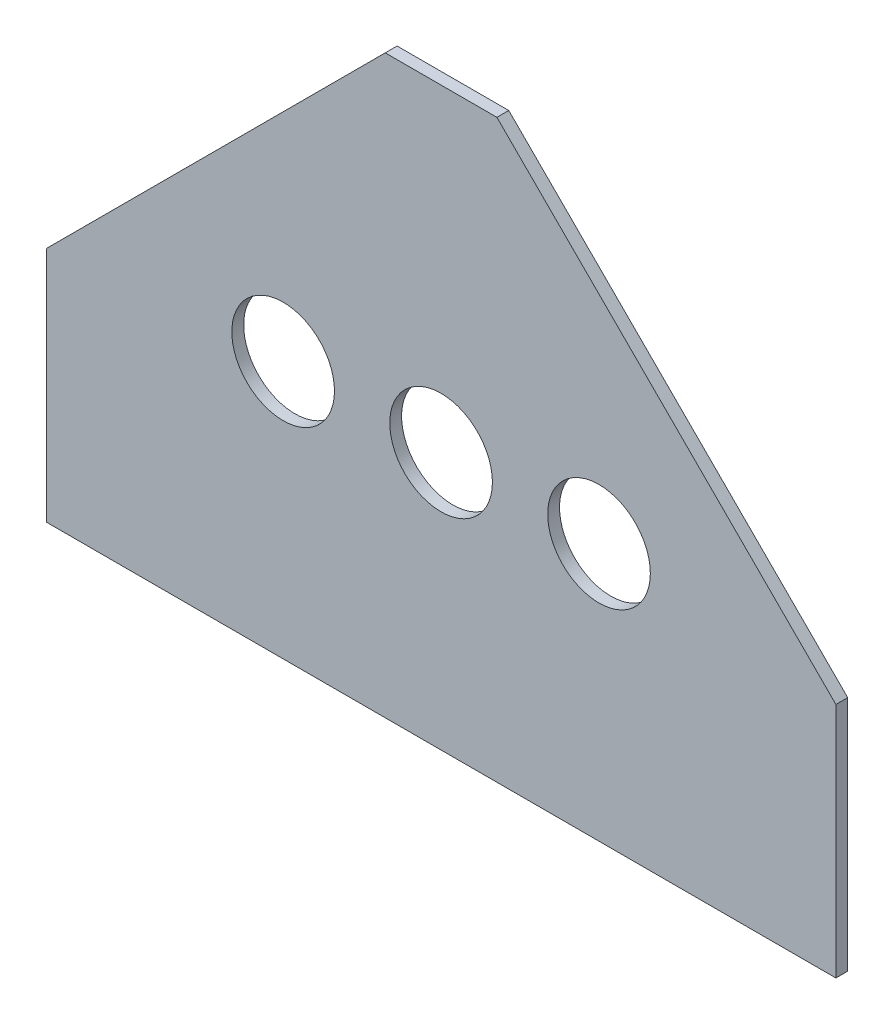
ISO-10303-21;
HEADER;
FILE_DESCRIPTION(('STEP AP214'),'2;1');
FILE_NAME('part.step','',(''),(''),'','','');
FILE_SCHEMA(('AUTOMOTIVE_DESIGN { 1 0 10303 214 1 1 1 1 }'));
ENDSEC;
DATA;
#1=APPLICATION_CONTEXT('core data for automotive mechanical design processes');
#2=APPLICATION_PROTOCOL_DEFINITION('international standard','automotive_design',2000,#1);
#3=PRODUCT_CONTEXT('',#1,'mechanical');
#4=PRODUCT('Part','Part','',(#3));
#5=PRODUCT_RELATED_PRODUCT_CATEGORY('part','',(#4));
#6=PRODUCT_DEFINITION_FORMATION('','',#4);
#7=PRODUCT_DEFINITION_CONTEXT('part definition',#1,'design');
#8=PRODUCT_DEFINITION('design','',#6,#7);
#9=PRODUCT_DEFINITION_SHAPE('','',#8);
#10=(LENGTH_UNIT() NAMED_UNIT(*) SI_UNIT(.MILLI.,.METRE.));
#11=(NAMED_UNIT(*) PLANE_ANGLE_UNIT() SI_UNIT($,.RADIAN.));
#12=(NAMED_UNIT(*) SI_UNIT($,.STERADIAN.) SOLID_ANGLE_UNIT());
#13=UNCERTAINTY_MEASURE_WITH_UNIT(LENGTH_MEASURE(1.E-05),#10,'distance_accuracy_value','');
#14=(GEOMETRIC_REPRESENTATION_CONTEXT(3) GLOBAL_UNCERTAINTY_ASSIGNED_CONTEXT((#13)) GLOBAL_UNIT_ASSIGNED_CONTEXT((#10,
#11,#12)) REPRESENTATION_CONTEXT('',''));
#15=CARTESIAN_POINT('',(0.,0.,0.));
#16=DIRECTION('',(0.,0.,1.));
#17=DIRECTION('',(1.,0.,0.));
#18=AXIS2_PLACEMENT_3D('',#15,#16,#17);
#19=CARTESIAN_POINT('',(-50.,0.,-1.5));
#20=DIRECTION('',(-1.,0.,0.));
#21=DIRECTION('',(0.,0.,1.));
#22=AXIS2_PLACEMENT_3D('',#19,#20,#21);
#23=PLANE('',#22);
#24=DIRECTION('',(0.,-1.,0.));
#25=VECTOR('',#24,1.);
#26=CARTESIAN_POINT('',(-50.,0.,0.));
#27=LINE('',#26,#25);
#28=CARTESIAN_POINT('',(-50.,30.,0.));
#29=VERTEX_POINT('',#28);
#30=CARTESIAN_POINT('',(-50.,0.,0.));
#31=VERTEX_POINT('',#30);
#32=EDGE_CURVE('E129',#29,#31,#27,.T.);
#33=ORIENTED_EDGE('',*,*,#32,.F.);
#34=DIRECTION('',(0.,0.,1.));
#35=VECTOR('',#34,1.);
#36=CARTESIAN_POINT('',(-50.,30.,-1.5));
#37=LINE('',#36,#35);
#38=CARTESIAN_POINT('',(-50.,30.,-1.5));
#39=VERTEX_POINT('',#38);
#40=EDGE_CURVE('E115',#39,#29,#37,.T.);
#41=ORIENTED_EDGE('',*,*,#40,.F.);
#42=DIRECTION('',(0.,-1.,0.));
#43=VECTOR('',#42,1.);
#44=CARTESIAN_POINT('',(-50.,0.,-1.5));
#45=LINE('',#44,#43);
#46=CARTESIAN_POINT('',(-50.,0.,-1.5));
#47=VERTEX_POINT('',#46);
#48=EDGE_CURVE('E108',#39,#47,#45,.T.);
#49=ORIENTED_EDGE('',*,*,#48,.T.);
#50=DIRECTION('',(0.,0.,1.));
#51=VECTOR('',#50,1.);
#52=CARTESIAN_POINT('',(-50.,0.,-1.5));
#53=LINE('',#52,#51);
#54=EDGE_CURVE('E91',#47,#31,#53,.T.);
#55=ORIENTED_EDGE('',*,*,#54,.T.);
#56=EDGE_LOOP('',(#33,#41,#49,#55));
#57=FACE_BOUND('',#56,.T.);
#58=ADVANCED_FACE('F40',(#57),#23,.T.);
#59=CARTESIAN_POINT('',(-50.,30.,-1.5));
#60=DIRECTION('',(-0.707106781186549,0.707106781186546,0.));
#61=DIRECTION('',(-0.707106781186546,-0.707106781186549,0.));
#62=AXIS2_PLACEMENT_3D('',#59,#60,#61);
#63=PLANE('',#62);
#64=DIRECTION('',(-0.707106781186546,-0.707106781186549,0.));
#65=VECTOR('',#64,1.);
#66=CARTESIAN_POINT('',(-50.,30.,0.));
#67=LINE('',#66,#65);
#68=CARTESIAN_POINT('',(-7.07106781186548,72.9289321881347,0.));
#69=VERTEX_POINT('',#68);
#70=EDGE_CURVE('E116',#69,#29,#67,.T.);
#71=ORIENTED_EDGE('',*,*,#70,.F.);
#72=DIRECTION('',(0.,0.,-1.));
#73=VECTOR('',#72,1.);
#74=CARTESIAN_POINT('',(-7.07106781186548,72.9289321881347,-1.5));
#75=LINE('',#74,#73);
#76=CARTESIAN_POINT('',(-7.07106781186547,72.9289321881347,-1.5));
#77=VERTEX_POINT('',#76);
#78=EDGE_CURVE('E48',#69,#77,#75,.T.);
#79=ORIENTED_EDGE('',*,*,#78,.T.);
#80=DIRECTION('',(-0.707106781186546,-0.707106781186549,0.));
#81=VECTOR('',#80,1.);
#82=CARTESIAN_POINT('',(-50.,30.,-1.5));
#83=LINE('',#82,#81);
#84=EDGE_CURVE('E102',#77,#39,#83,.T.);
#85=ORIENTED_EDGE('',*,*,#84,.T.);
#86=ORIENTED_EDGE('',*,*,#40,.T.);
#87=EDGE_LOOP('',(#71,#79,#85,#86));
#88=FACE_BOUND('',#87,.T.);
#89=ADVANCED_FACE('F163',(#88),#63,.T.);
#90=CARTESIAN_POINT('',(0.,80.0000000000002,-1.5));
#91=DIRECTION('',(0.707106781186549,0.707106781186546,0.));
#92=DIRECTION('',(-0.707106781186546,0.707106781186549,0.));
#93=AXIS2_PLACEMENT_3D('',#90,#91,#92);
#94=PLANE('',#93);
#95=DIRECTION('',(-0.707106781186546,0.707106781186549,0.));
#96=VECTOR('',#95,1.);
#97=CARTESIAN_POINT('',(0.,80.0000000000002,-1.5));
#98=LINE('',#97,#96);
#99=CARTESIAN_POINT('',(50.,30.,-1.5));
#100=VERTEX_POINT('',#99);
#101=CARTESIAN_POINT('',(7.0710678118654,72.9289321881348,-1.5));
#102=VERTEX_POINT('',#101);
#103=EDGE_CURVE('E125',#100,#102,#98,.T.);
#104=ORIENTED_EDGE('',*,*,#103,.T.);
#105=DIRECTION('',(0.,0.,1.));
#106=VECTOR('',#105,1.);
#107=CARTESIAN_POINT('',(7.07106781186541,72.9289321881348,-1.5));
#108=LINE('',#107,#106);
#109=CARTESIAN_POINT('',(7.07106781186541,72.9289321881348,0.));
#110=VERTEX_POINT('',#109);
#111=EDGE_CURVE('E138',#102,#110,#108,.T.);
#112=ORIENTED_EDGE('',*,*,#111,.T.);
#113=DIRECTION('',(-0.707106781186546,0.707106781186549,0.));
#114=VECTOR('',#113,1.);
#115=CARTESIAN_POINT('',(0.,80.0000000000002,0.));
#116=LINE('',#115,#114);
#117=CARTESIAN_POINT('',(50.,30.,0.));
#118=VERTEX_POINT('',#117);
#119=EDGE_CURVE('E118',#118,#110,#116,.T.);
#120=ORIENTED_EDGE('',*,*,#119,.F.);
#121=DIRECTION('',(0.,0.,1.));
#122=VECTOR('',#121,1.);
#123=CARTESIAN_POINT('',(50.,30.,-1.5));
#124=LINE('',#123,#122);
#125=EDGE_CURVE('E139',#100,#118,#124,.T.);
#126=ORIENTED_EDGE('',*,*,#125,.F.);
#127=EDGE_LOOP('',(#104,#112,#120,#126));
#128=FACE_BOUND('',#127,.T.);
#129=ADVANCED_FACE('F147',(#128),#94,.T.);
#130=CARTESIAN_POINT('',(50.,30.,-1.5));
#131=DIRECTION('',(1.,0.,0.));
#132=DIRECTION('',(0.,0.,-1.));
#133=AXIS2_PLACEMENT_3D('',#130,#131,#132);
#134=PLANE('',#133);
#135=DIRECTION('',(0.,1.,0.));
#136=VECTOR('',#135,1.);
#137=CARTESIAN_POINT('',(50.,30.,0.));
#138=LINE('',#137,#136);
#139=CARTESIAN_POINT('',(50.,0.,0.));
#140=VERTEX_POINT('',#139);
#141=EDGE_CURVE('E133',#140,#118,#138,.T.);
#142=ORIENTED_EDGE('',*,*,#141,.F.);
#143=DIRECTION('',(0.,0.,1.));
#144=VECTOR('',#143,1.);
#145=CARTESIAN_POINT('',(50.,0.,-1.5));
#146=LINE('',#145,#144);
#147=CARTESIAN_POINT('',(50.,0.,-1.5));
#148=VERTEX_POINT('',#147);
#149=EDGE_CURVE('E101',#148,#140,#146,.T.);
#150=ORIENTED_EDGE('',*,*,#149,.F.);
#151=DIRECTION('',(0.,1.,0.));
#152=VECTOR('',#151,1.);
#153=CARTESIAN_POINT('',(50.,30.,-1.5));
#154=LINE('',#153,#152);
#155=EDGE_CURVE('E111',#148,#100,#154,.T.);
#156=ORIENTED_EDGE('',*,*,#155,.T.);
#157=ORIENTED_EDGE('',*,*,#125,.T.);
#158=EDGE_LOOP('',(#142,#150,#156,#157));
#159=FACE_BOUND('',#158,.T.);
#160=ADVANCED_FACE('F153',(#159),#134,.T.);
#161=CARTESIAN_POINT('',(-50.,0.,-1.5));
#162=DIRECTION('',(0.,-1.,0.));
#163=DIRECTION('',(0.,0.,-1.));
#164=AXIS2_PLACEMENT_3D('',#161,#162,#163);
#165=PLANE('',#164);
#166=DIRECTION('',(1.,0.,0.));
#167=VECTOR('',#166,1.);
#168=CARTESIAN_POINT('',(-50.,0.,0.));
#169=LINE('',#168,#167);
#170=EDGE_CURVE('E96',#31,#140,#169,.T.);
#171=ORIENTED_EDGE('',*,*,#170,.F.);
#172=ORIENTED_EDGE('',*,*,#54,.F.);
#173=DIRECTION('',(1.,0.,0.));
#174=VECTOR('',#173,1.);
#175=CARTESIAN_POINT('',(-50.,0.,-1.5));
#176=LINE('',#175,#174);
#177=EDGE_CURVE('E94',#47,#148,#176,.T.);
#178=ORIENTED_EDGE('',*,*,#177,.T.);
#179=ORIENTED_EDGE('',*,*,#149,.T.);
#180=EDGE_LOOP('',(#171,#172,#178,#179));
#181=FACE_BOUND('',#180,.T.);
#182=ADVANCED_FACE('F93',(#181),#165,.T.);
#183=CARTESIAN_POINT('',(0.,0.,-1.5));
#184=DIRECTION('',(0.,0.,-1.));
#185=DIRECTION('',(-1.,0.,0.));
#186=AXIS2_PLACEMENT_3D('',#183,#184,#185);
#187=PLANE('',#186);
#188=CARTESIAN_POINT('',(-20.,32.6238456605015,-1.5));
#189=DIRECTION('',(0.,0.,1.));
#190=DIRECTION('',(1.,0.,0.));
#191=AXIS2_PLACEMENT_3D('',#188,#189,#190);
#192=CIRCLE('',#191,6.5);
#193=CARTESIAN_POINT('',(-13.5,32.6238456605015,-1.5));
#194=VERTEX_POINT('',#193);
#195=EDGE_CURVE('E197',#194,#194,#192,.T.);
#196=ORIENTED_EDGE('',*,*,#195,.T.);
#197=EDGE_LOOP('',(#196));
#198=FACE_BOUND('',#197,.T.);
#199=CARTESIAN_POINT('',(20.,32.6238456605015,-1.5));
#200=DIRECTION('',(0.,0.,1.));
#201=DIRECTION('',(1.,0.,0.));
#202=AXIS2_PLACEMENT_3D('',#199,#200,#201);
#203=CIRCLE('',#202,6.5);
#204=CARTESIAN_POINT('',(26.5,32.6238456605015,-1.5));
#205=VERTEX_POINT('',#204);
#206=EDGE_CURVE('E192',#205,#205,#203,.T.);
#207=ORIENTED_EDGE('',*,*,#206,.T.);
#208=EDGE_LOOP('',(#207));
#209=FACE_BOUND('',#208,.T.);
#210=CARTESIAN_POINT('',(0.,32.6238456605015,-1.5));
#211=DIRECTION('',(0.,0.,1.));
#212=DIRECTION('',(1.,0.,0.));
#213=AXIS2_PLACEMENT_3D('',#210,#211,#212);
#214=CIRCLE('',#213,6.5);
#215=CARTESIAN_POINT('',(6.5,32.6238456605015,-1.5));
#216=VERTEX_POINT('',#215);
#217=EDGE_CURVE('E131',#216,#216,#214,.T.);
#218=ORIENTED_EDGE('',*,*,#217,.T.);
#219=EDGE_LOOP('',(#218));
#220=FACE_BOUND('',#219,.T.);
#221=ORIENTED_EDGE('',*,*,#84,.F.);
#222=DIRECTION('',(-1.,0.,0.));
#223=VECTOR('',#222,1.);
#224=CARTESIAN_POINT('',(-3.5782864515141E-13,72.9289321881347,-1.5));
#225=LINE('',#224,#223);
#226=EDGE_CURVE('E11',#77,#102,#225,.F.);
#227=ORIENTED_EDGE('',*,*,#226,.T.);
#228=ORIENTED_EDGE('',*,*,#103,.F.);
#229=ORIENTED_EDGE('',*,*,#155,.F.);
#230=ORIENTED_EDGE('',*,*,#177,.F.);
#231=ORIENTED_EDGE('',*,*,#48,.F.);
#232=EDGE_LOOP('',(#221,#227,#228,#229,#230,#231));
#233=FACE_BOUND('',#232,.T.);
#234=ADVANCED_FACE('F107',(#198,#209,#220,#233),#187,.T.);
#235=CARTESIAN_POINT('',(0.,0.,0.));
#236=DIRECTION('',(0.,0.,-1.));
#237=DIRECTION('',(-1.,0.,0.));
#238=AXIS2_PLACEMENT_3D('',#235,#236,#237);
#239=PLANE('',#238);
#240=CARTESIAN_POINT('',(-20.,32.6238456605015,0.));
#241=DIRECTION('',(0.,0.,1.));
#242=DIRECTION('',(1.,0.,0.));
#243=AXIS2_PLACEMENT_3D('',#240,#241,#242);
#244=CIRCLE('',#243,6.5);
#245=CARTESIAN_POINT('',(-13.5,32.6238456605015,0.));
#246=VERTEX_POINT('',#245);
#247=EDGE_CURVE('E201',#246,#246,#244,.T.);
#248=ORIENTED_EDGE('',*,*,#247,.F.);
#249=EDGE_LOOP('',(#248));
#250=FACE_BOUND('',#249,.T.);
#251=CARTESIAN_POINT('',(20.,32.6238456605015,0.));
#252=DIRECTION('',(0.,0.,1.));
#253=DIRECTION('',(1.,0.,0.));
#254=AXIS2_PLACEMENT_3D('',#251,#252,#253);
#255=CIRCLE('',#254,6.5);
#256=CARTESIAN_POINT('',(26.5,32.6238456605015,0.));
#257=VERTEX_POINT('',#256);
#258=EDGE_CURVE('E195',#257,#257,#255,.T.);
#259=ORIENTED_EDGE('',*,*,#258,.F.);
#260=EDGE_LOOP('',(#259));
#261=FACE_BOUND('',#260,.T.);
#262=CARTESIAN_POINT('',(0.,32.6238456605015,0.));
#263=DIRECTION('',(0.,0.,1.));
#264=DIRECTION('',(1.,0.,0.));
#265=AXIS2_PLACEMENT_3D('',#262,#263,#264);
#266=CIRCLE('',#265,6.5);
#267=CARTESIAN_POINT('',(6.5,32.6238456605015,0.));
#268=VERTEX_POINT('',#267);
#269=EDGE_CURVE('E121',#268,#268,#266,.T.);
#270=ORIENTED_EDGE('',*,*,#269,.F.);
#271=EDGE_LOOP('',(#270));
#272=FACE_BOUND('',#271,.T.);
#273=ORIENTED_EDGE('',*,*,#119,.T.);
#274=DIRECTION('',(1.,0.,0.));
#275=VECTOR('',#274,1.);
#276=CARTESIAN_POINT('',(7.07106781186541,72.9289321881348,0.));
#277=LINE('',#276,#275);
#278=EDGE_CURVE('E62',#110,#69,#277,.F.);
#279=ORIENTED_EDGE('',*,*,#278,.T.);
#280=ORIENTED_EDGE('',*,*,#70,.T.);
#281=ORIENTED_EDGE('',*,*,#32,.T.);
#282=ORIENTED_EDGE('',*,*,#170,.T.);
#283=ORIENTED_EDGE('',*,*,#141,.T.);
#284=EDGE_LOOP('',(#273,#279,#280,#281,#282,#283));
#285=FACE_BOUND('',#284,.T.);
#286=ADVANCED_FACE('F150',(#250,#261,#272,#285),#239,.F.);
#287=CARTESIAN_POINT('',(0.,32.6238456605015,-1.5));
#288=DIRECTION('',(0.,0.,1.));
#289=DIRECTION('',(1.,0.,0.));
#290=AXIS2_PLACEMENT_3D('',#287,#288,#289);
#291=CYLINDRICAL_SURFACE('',#290,6.5);
#292=ORIENTED_EDGE('',*,*,#217,.F.);
#293=EDGE_LOOP('',(#292));
#294=FACE_BOUND('',#293,.T.);
#295=ORIENTED_EDGE('',*,*,#269,.T.);
#296=EDGE_LOOP('',(#295));
#297=FACE_BOUND('',#296,.T.);
#298=ADVANCED_FACE('F177',(#294,#297),#291,.F.);
#299=CARTESIAN_POINT('',(20.,32.6238456605015,-1.5));
#300=DIRECTION('',(0.,0.,1.));
#301=DIRECTION('',(1.,0.,0.));
#302=AXIS2_PLACEMENT_3D('',#299,#300,#301);
#303=CYLINDRICAL_SURFACE('',#302,6.5);
#304=ORIENTED_EDGE('',*,*,#206,.F.);
#305=EDGE_LOOP('',(#304));
#306=FACE_BOUND('',#305,.T.);
#307=ORIENTED_EDGE('',*,*,#258,.T.);
#308=EDGE_LOOP('',(#307));
#309=FACE_BOUND('',#308,.T.);
#310=ADVANCED_FACE('F159',(#306,#309),#303,.F.);
#311=CARTESIAN_POINT('',(-20.,32.6238456605015,-1.5));
#312=DIRECTION('',(0.,0.,1.));
#313=DIRECTION('',(1.,0.,0.));
#314=AXIS2_PLACEMENT_3D('',#311,#312,#313);
#315=CYLINDRICAL_SURFACE('',#314,6.5);
#316=ORIENTED_EDGE('',*,*,#195,.F.);
#317=EDGE_LOOP('',(#316));
#318=FACE_BOUND('',#317,.T.);
#319=ORIENTED_EDGE('',*,*,#247,.T.);
#320=EDGE_LOOP('',(#319));
#321=FACE_BOUND('',#320,.T.);
#322=ADVANCED_FACE('F155',(#318,#321),#315,.F.);
#323=CARTESIAN_POINT('',(7.07106781186541,72.9289321881348,-1.5));
#324=DIRECTION('',(0.,-1.,0.));
#325=DIRECTION('',(0.,0.,1.));
#326=AXIS2_PLACEMENT_3D('',#323,#324,#325);
#327=PLANE('',#326);
#328=ORIENTED_EDGE('',*,*,#226,.F.);
#329=ORIENTED_EDGE('',*,*,#78,.F.);
#330=ORIENTED_EDGE('',*,*,#278,.F.);
#331=ORIENTED_EDGE('',*,*,#111,.F.);
#332=EDGE_LOOP('',(#328,#329,#330,#331));
#333=FACE_BOUND('',#332,.T.);
#334=ADVANCED_FACE('F42',(#333),#327,.F.);
#335=CLOSED_SHELL('',(#58,#89,#129,#160,#182,#234,#286,#298,#310,#322,#334));
#336=MANIFOLD_SOLID_BREP('B2',#335);
#337=ADVANCED_BREP_SHAPE_REPRESENTATION('',(#18,#336),#14);
#338=SHAPE_DEFINITION_REPRESENTATION(#9,#337);
ENDSEC;
END-ISO-10303-21;
